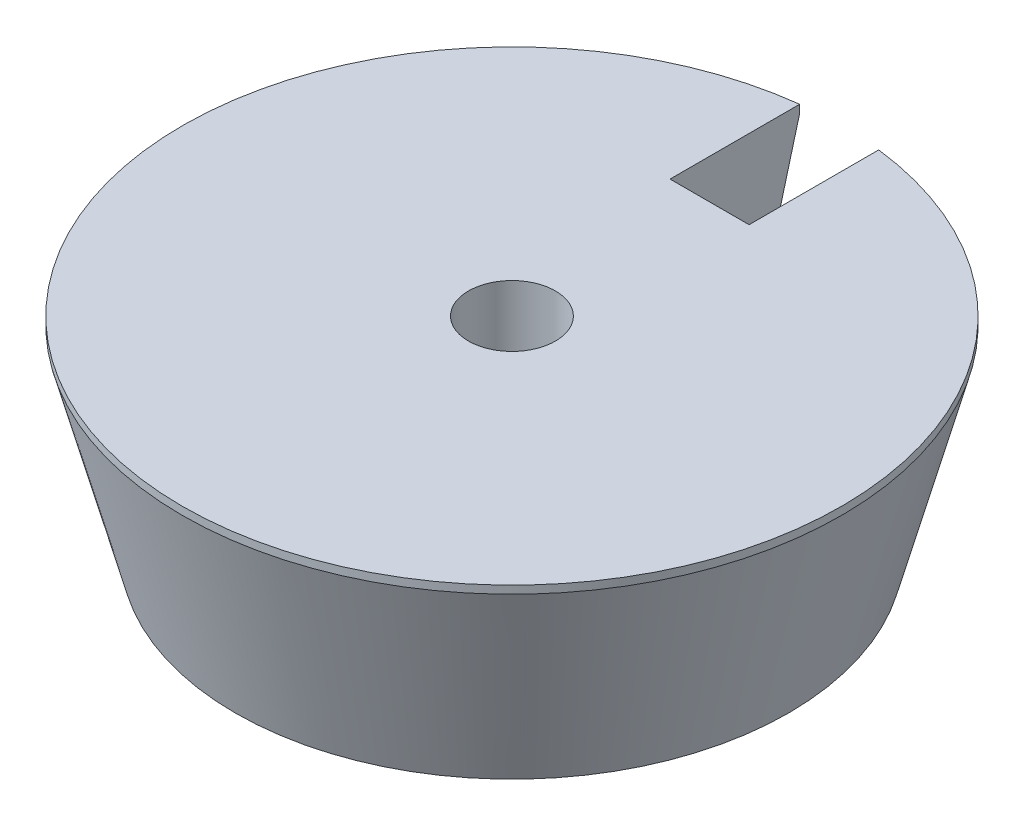
ISO-10303-21;
HEADER;
FILE_DESCRIPTION(('STEP AP214'),'2;1');
FILE_NAME('part.step','',(''),(''),'','','');
FILE_SCHEMA(('AUTOMOTIVE_DESIGN { 1 0 10303 214 1 1 1 1 }'));
ENDSEC;
DATA;
#1=APPLICATION_CONTEXT('core data for automotive mechanical design processes');
#2=APPLICATION_PROTOCOL_DEFINITION('international standard','automotive_design',2000,#1);
#3=PRODUCT_CONTEXT('',#1,'mechanical');
#4=PRODUCT('Part','Part','',(#3));
#5=PRODUCT_RELATED_PRODUCT_CATEGORY('part','',(#4));
#6=PRODUCT_DEFINITION_FORMATION('','',#4);
#7=PRODUCT_DEFINITION_CONTEXT('part definition',#1,'design');
#8=PRODUCT_DEFINITION('design','',#6,#7);
#9=PRODUCT_DEFINITION_SHAPE('','',#8);
#10=(LENGTH_UNIT() NAMED_UNIT(*) SI_UNIT(.MILLI.,.METRE.));
#11=(NAMED_UNIT(*) PLANE_ANGLE_UNIT() SI_UNIT($,.RADIAN.));
#12=(NAMED_UNIT(*) SI_UNIT($,.STERADIAN.) SOLID_ANGLE_UNIT());
#13=UNCERTAINTY_MEASURE_WITH_UNIT(LENGTH_MEASURE(1.E-05),#10,'distance_accuracy_value','');
#14=(GEOMETRIC_REPRESENTATION_CONTEXT(3) GLOBAL_UNCERTAINTY_ASSIGNED_CONTEXT((#13)) GLOBAL_UNIT_ASSIGNED_CONTEXT((#10,
#11,#12)) REPRESENTATION_CONTEXT('',''));
#15=CARTESIAN_POINT('',(0.,0.,0.));
#16=DIRECTION('',(0.,0.,1.));
#17=DIRECTION('',(1.,0.,0.));
#18=AXIS2_PLACEMENT_3D('',#15,#16,#17);
#19=CARTESIAN_POINT('',(0.,0.,0.));
#20=DIRECTION('',(0.,1.,0.));
#21=DIRECTION('',(0.,0.,1.));
#22=AXIS2_PLACEMENT_3D('',#19,#20,#21);
#23=PLANE('',#22);
#24=CARTESIAN_POINT('',(0.,0.,0.));
#25=DIRECTION('',(0.,1.,0.));
#26=DIRECTION('',(0.,0.,1.));
#27=AXIS2_PLACEMENT_3D('',#24,#25,#26);
#28=CIRCLE('',#27,35.);
#29=CARTESIAN_POINT('',(-5.,0.,-34.6410161513776));
#30=VERTEX_POINT('',#29);
#31=CARTESIAN_POINT('',(5.,0.,-34.6410161513776));
#32=VERTEX_POINT('',#31);
#33=EDGE_CURVE('E156',#30,#32,#28,.T.);
#34=ORIENTED_EDGE('',*,*,#33,.F.);
#35=DIRECTION('',(0.,0.,1.));
#36=VECTOR('',#35,1.);
#37=CARTESIAN_POINT('',(-5.,0.,0.));
#38=LINE('',#37,#36);
#39=CARTESIAN_POINT('',(-5.,0.,-25.));
#40=VERTEX_POINT('',#39);
#41=EDGE_CURVE('E52',#30,#40,#38,.T.);
#42=ORIENTED_EDGE('',*,*,#41,.T.);
#43=DIRECTION('',(1.,0.,0.));
#44=VECTOR('',#43,1.);
#45=CARTESIAN_POINT('',(0.,0.,-25.));
#46=LINE('',#45,#44);
#47=CARTESIAN_POINT('',(5.,0.,-25.));
#48=VERTEX_POINT('',#47);
#49=EDGE_CURVE('E120',#40,#48,#46,.T.);
#50=ORIENTED_EDGE('',*,*,#49,.T.);
#51=DIRECTION('',(0.,0.,-1.));
#52=VECTOR('',#51,1.);
#53=CARTESIAN_POINT('',(5.,0.,0.));
#54=LINE('',#53,#52);
#55=EDGE_CURVE('E130',#48,#32,#54,.T.);
#56=ORIENTED_EDGE('',*,*,#55,.T.);
#57=EDGE_LOOP('',(#34,#42,#50,#56));
#58=FACE_BOUND('',#57,.T.);
#59=CARTESIAN_POINT('',(0.,0.,0.));
#60=DIRECTION('',(0.,1.,0.));
#61=DIRECTION('',(0.,0.,1.));
#62=AXIS2_PLACEMENT_3D('',#59,#60,#61);
#63=CIRCLE('',#62,8.);
#64=CARTESIAN_POINT('',(0.,0.,8.));
#65=VERTEX_POINT('',#64);
#66=EDGE_CURVE('E11',#65,#65,#63,.F.);
#67=ORIENTED_EDGE('',*,*,#66,.F.);
#68=EDGE_LOOP('',(#67));
#69=FACE_BOUND('',#68,.T.);
#70=ADVANCED_FACE('F36',(#58,#69),#23,.F.);
#71=CARTESIAN_POINT('',(0.,0.,0.));
#72=DIRECTION('',(0.,1.,0.));
#73=DIRECTION('',(0.,0.,1.));
#74=AXIS2_PLACEMENT_3D('',#71,#72,#73);
#75=CONICAL_SURFACE('',#74,35.,0.261799387799149);
#76=CARTESIAN_POINT('',(0.,25.,0.));
#77=DIRECTION('',(0.,1.,0.));
#78=DIRECTION('',(0.,0.,1.));
#79=AXIS2_PLACEMENT_3D('',#76,#77,#78);
#80=CIRCLE('',#79,41.6987298107781);
#81=CARTESIAN_POINT('',(-5.,25.,-41.3978751608373));
#82=VERTEX_POINT('',#81);
#83=CARTESIAN_POINT('',(5.,25.,-41.3978751608373));
#84=VERTEX_POINT('',#83);
#85=EDGE_CURVE('E45',#82,#84,#80,.T.);
#86=ORIENTED_EDGE('',*,*,#85,.F.);
#87=CARTESIAN_POINT('',(-5.,59.7008365789733,-50.7510855753396));
#88=CARTESIAN_POINT('',(-5.,55.0283029117261,-49.493006797825));
#89=CARTESIAN_POINT('',(-5.,50.3558745568069,-48.2345366221793));
#90=CARTESIAN_POINT('',(-5.,41.0113050061608,-45.7165322731879));
#91=CARTESIAN_POINT('',(-5.,36.3391638104089,-44.4569980999359));
#92=CARTESIAN_POINT('',(-5.,26.9952520128095,-41.9365864160447));
#93=CARTESIAN_POINT('',(-5.,22.3234814103622,-40.6757089076295));
#94=CARTESIAN_POINT('',(-5.,12.980418344324,-38.1521808599432));
#95=CARTESIAN_POINT('',(-5.,8.30912588079699,-36.8895303204348));
#96=CARTESIAN_POINT('',(-5.,-1.03282019481578,-34.36183096867));
#97=CARTESIAN_POINT('',(-5.,-5.70347380561218,-33.0967821516474));
#98=CARTESIAN_POINT('',(-5.,-15.0438748372793,-30.5633478619011));
#99=CARTESIAN_POINT('',(-5.,-19.7136222584475,-29.2949623902745));
#100=CARTESIAN_POINT('',(-5.,-26.7172467487516,-27.3887045992771));
#101=CARTESIAN_POINT('',(-5.,-29.0516243733246,-26.7526714609152));
#102=CARTESIAN_POINT('',(-5.,-33.7199620428748,-25.4790754133097));
#103=CARTESIAN_POINT('',(-5.,-36.0539220879005,-24.8415125042439));
#104=CARTESIAN_POINT('',(-5.,-40.7213245699261,-23.5644839827794));
#105=CARTESIAN_POINT('',(-5.,-43.0547670063553,-22.9250183682945));
#106=CARTESIAN_POINT('',(-5.,-47.7209712490949,-21.6436053928362));
#107=CARTESIAN_POINT('',(-5.,-50.0537330551318,-21.0016580308668));
#108=CARTESIAN_POINT('',(-5.,-52.3860733786992,-20.358180181796));
#109=B_SPLINE_CURVE_WITH_KNOTS('',3,(#87,#88,#89,#90,#91,#92,#93,#94,#95,#96,#97,#98,#99,#100,
#101,#102,#103,#104,#105,#106,#107,#108),.UNSPECIFIED.,.F.,.F.,(4,2,2,2,2,2,2,2,2,2,4),(0.,
14.5168178427988,29.033634408101,43.5504269776351,58.0672214903298,72.5840448823932,
87.1008635017082,94.3592867114056,101.617709077428,108.876139404769,116.134572645342),.UNSPECIFIED.);
#110=EDGE_CURVE('E90',#82,#30,#109,.T.);
#111=ORIENTED_EDGE('',*,*,#110,.T.);
#112=ORIENTED_EDGE('',*,*,#33,.T.);
#113=CARTESIAN_POINT('',(5.,-52.3860733786992,-20.358180181796));
#114=CARTESIAN_POINT('',(5.,-51.0482978654567,-20.7272840873978));
#115=CARTESIAN_POINT('',(5.,-49.7103786134008,-21.095866560875));
#116=CARTESIAN_POINT('',(5.,-47.0342902465631,-21.8321227179531));
#117=CARTESIAN_POINT('',(5.,-45.6961211318131,-22.19979640167));
#118=CARTESIAN_POINT('',(5.,-41.6812962268502,-23.3016551576196));
#119=CARTESIAN_POINT('',(5.,-39.0043215535334,-24.034678299225));
#120=CARTESIAN_POINT('',(5.,-33.6497354982995,-25.4983799823178));
#121=CARTESIAN_POINT('',(5.,-30.9721241172532,-26.2290585269918));
#122=CARTESIAN_POINT('',(5.,-25.6164039314828,-27.6885914327707));
#123=CARTESIAN_POINT('',(5.,-22.9382951266917,-28.4174457936297));
#124=CARTESIAN_POINT('',(5.,-16.2776808286859,-30.2282268937288));
#125=CARTESIAN_POINT('',(5.,-12.2949384062633,-31.3092820370164));
#126=CARTESIAN_POINT('',(5.,-4.32882349930162,-33.4690762140366));
#127=CARTESIAN_POINT('',(5.,-0.345451014422946,-34.5478152465164));
#128=CARTESIAN_POINT('',(5.,8.3091328606096,-36.8895331550201));
#129=CARTESIAN_POINT('',(5.,12.9804327272532,-38.1521850023614));
#130=CARTESIAN_POINT('',(5.,22.3235111703942,-40.6757166880779));
#131=CARTESIAN_POINT('',(5.,26.9952897469089,-41.9365965263888));
#132=CARTESIAN_POINT('',(5.,36.3392023344357,-44.4570085593186));
#133=CARTESIAN_POINT('',(5.,41.0113363448658,-45.7165407560956));
#134=CARTESIAN_POINT('',(5.,50.3558906685911,-48.2345409254183));
#135=CARTESIAN_POINT('',(5.,55.0283109818592,-49.4930088980651));
#136=CARTESIAN_POINT('',(5.,59.7008365789733,-50.7510855753396));
#137=B_SPLINE_CURVE_WITH_KNOTS('',3,(#113,#114,#115,#116,#117,#118,#119,#120,#121,#122,#123,
#124,#125,#126,#127,#128,#129,#130,#131,#132,#133,#134,#135,#136),.UNSPECIFIED.,.F.,.F.,(4,2,2,
2,2,2,2,2,2,2,2,4),(0.,4.16328316354522,8.32656579621177,16.6531269463695,24.9796767746401,
33.3062277258565,45.686786309248,58.0673515876633,72.5841685510812,87.1009860413439,
101.617780249581,116.134573077993),.UNSPECIFIED.);
#138=EDGE_CURVE('E60',#32,#84,#137,.T.);
#139=ORIENTED_EDGE('',*,*,#138,.T.);
#140=EDGE_LOOP('',(#86,#111,#112,#139));
#141=FACE_BOUND('',#140,.T.);
#142=ADVANCED_FACE('F38',(#141),#75,.T.);
#143=CARTESIAN_POINT('',(0.,-12.,0.));
#144=DIRECTION('',(0.,1.,0.));
#145=DIRECTION('',(0.,0.,1.));
#146=AXIS2_PLACEMENT_3D('',#143,#144,#145);
#147=CYLINDRICAL_SURFACE('',#146,8.);
#148=CARTESIAN_POINT('',(0.,-12.,0.));
#149=DIRECTION('',(0.,-1.,0.));
#150=DIRECTION('',(0.,0.,-1.));
#151=AXIS2_PLACEMENT_3D('',#148,#149,#150);
#152=CIRCLE('',#151,8.);
#153=CARTESIAN_POINT('',(0.,-12.,-8.));
#154=VERTEX_POINT('',#153);
#155=EDGE_CURVE('E153',#154,#154,#152,.T.);
#156=ORIENTED_EDGE('',*,*,#155,.F.);
#157=EDGE_LOOP('',(#156));
#158=FACE_BOUND('',#157,.T.);
#159=ORIENTED_EDGE('',*,*,#66,.T.);
#160=EDGE_LOOP('',(#159));
#161=FACE_BOUND('',#160,.T.);
#162=ADVANCED_FACE('F166',(#158,#161),#147,.T.);
#163=CARTESIAN_POINT('',(0.,-12.,0.));
#164=DIRECTION('',(0.,-1.,0.));
#165=DIRECTION('',(0.,0.,-1.));
#166=AXIS2_PLACEMENT_3D('',#163,#164,#165);
#167=PLANE('',#166);
#168=CARTESIAN_POINT('',(0.,-12.,0.));
#169=DIRECTION('',(0.,1.,0.));
#170=DIRECTION('',(0.,0.,1.));
#171=AXIS2_PLACEMENT_3D('',#168,#169,#170);
#172=CIRCLE('',#171,5.49999999999999);
#173=CARTESIAN_POINT('',(0.,-12.,5.49999999999999));
#174=VERTEX_POINT('',#173);
#175=EDGE_CURVE('E108',#174,#174,#172,.T.);
#176=ORIENTED_EDGE('',*,*,#175,.T.);
#177=EDGE_LOOP('',(#176));
#178=FACE_BOUND('',#177,.T.);
#179=ORIENTED_EDGE('',*,*,#155,.T.);
#180=EDGE_LOOP('',(#179));
#181=FACE_BOUND('',#180,.T.);
#182=ADVANCED_FACE('F145',(#178,#181),#167,.T.);
#183=CARTESIAN_POINT('',(-5.,-12.,-55.));
#184=DIRECTION('',(-1.,0.,0.));
#185=DIRECTION('',(0.,0.,1.));
#186=AXIS2_PLACEMENT_3D('',#183,#184,#185);
#187=PLANE('',#186);
#188=ORIENTED_EDGE('',*,*,#110,.F.);
#189=DIRECTION('',(0.,-1.,0.));
#190=VECTOR('',#189,1.);
#191=CARTESIAN_POINT('',(-5.,26.,-41.3978751608373));
#192=LINE('',#191,#190);
#193=CARTESIAN_POINT('',(-5.,26.,-41.3978751608373));
#194=VERTEX_POINT('',#193);
#195=EDGE_CURVE('E84',#194,#82,#192,.T.);
#196=ORIENTED_EDGE('',*,*,#195,.F.);
#197=DIRECTION('',(0.,0.,1.));
#198=VECTOR('',#197,1.);
#199=CARTESIAN_POINT('',(-5.,26.,0.));
#200=LINE('',#199,#198);
#201=CARTESIAN_POINT('',(-5.,26.,-25.));
#202=VERTEX_POINT('',#201);
#203=EDGE_CURVE('E88',#194,#202,#200,.T.);
#204=ORIENTED_EDGE('',*,*,#203,.T.);
#205=DIRECTION('',(0.,1.,0.));
#206=VECTOR('',#205,1.);
#207=CARTESIAN_POINT('',(-5.,-12.,-25.));
#208=LINE('',#207,#206);
#209=EDGE_CURVE('E94',#40,#202,#208,.T.);
#210=ORIENTED_EDGE('',*,*,#209,.F.);
#211=ORIENTED_EDGE('',*,*,#41,.F.);
#212=EDGE_LOOP('',(#188,#196,#204,#210,#211));
#213=FACE_BOUND('',#212,.T.);
#214=ADVANCED_FACE('F86',(#213),#187,.F.);
#215=CARTESIAN_POINT('',(5.,-12.,-55.));
#216=DIRECTION('',(1.,0.,0.));
#217=DIRECTION('',(0.,0.,-1.));
#218=AXIS2_PLACEMENT_3D('',#215,#216,#217);
#219=PLANE('',#218);
#220=DIRECTION('',(0.,1.,0.));
#221=VECTOR('',#220,1.);
#222=CARTESIAN_POINT('',(5.,-12.,-25.));
#223=LINE('',#222,#221);
#224=CARTESIAN_POINT('',(5.,26.,-25.));
#225=VERTEX_POINT('',#224);
#226=EDGE_CURVE('E118',#48,#225,#223,.T.);
#227=ORIENTED_EDGE('',*,*,#226,.T.);
#228=DIRECTION('',(0.,0.,-1.));
#229=VECTOR('',#228,1.);
#230=CARTESIAN_POINT('',(5.,26.,0.));
#231=LINE('',#230,#229);
#232=CARTESIAN_POINT('',(5.,26.,-41.3978751608373));
#233=VERTEX_POINT('',#232);
#234=EDGE_CURVE('E103',#225,#233,#231,.T.);
#235=ORIENTED_EDGE('',*,*,#234,.T.);
#236=DIRECTION('',(0.,-1.,0.));
#237=VECTOR('',#236,1.);
#238=CARTESIAN_POINT('',(5.,26.,-41.3978751608373));
#239=LINE('',#238,#237);
#240=EDGE_CURVE('E95',#233,#84,#239,.T.);
#241=ORIENTED_EDGE('',*,*,#240,.T.);
#242=ORIENTED_EDGE('',*,*,#138,.F.);
#243=ORIENTED_EDGE('',*,*,#55,.F.);
#244=EDGE_LOOP('',(#227,#235,#241,#242,#243));
#245=FACE_BOUND('',#244,.T.);
#246=ADVANCED_FACE('F132',(#245),#219,.F.);
#247=CARTESIAN_POINT('',(-5.,-12.,-25.));
#248=DIRECTION('',(0.,0.,1.));
#249=DIRECTION('',(1.,0.,0.));
#250=AXIS2_PLACEMENT_3D('',#247,#248,#249);
#251=PLANE('',#250);
#252=ORIENTED_EDGE('',*,*,#209,.T.);
#253=DIRECTION('',(1.,0.,0.));
#254=VECTOR('',#253,1.);
#255=CARTESIAN_POINT('',(0.,26.,-25.));
#256=LINE('',#255,#254);
#257=EDGE_CURVE('E107',#202,#225,#256,.T.);
#258=ORIENTED_EDGE('',*,*,#257,.T.);
#259=ORIENTED_EDGE('',*,*,#226,.F.);
#260=ORIENTED_EDGE('',*,*,#49,.F.);
#261=EDGE_LOOP('',(#252,#258,#259,#260));
#262=FACE_BOUND('',#261,.T.);
#263=ADVANCED_FACE('F137',(#262),#251,.F.);
#264=CARTESIAN_POINT('',(0.,26.,0.));
#265=DIRECTION('',(0.,-1.,0.));
#266=DIRECTION('',(0.,0.,-1.));
#267=AXIS2_PLACEMENT_3D('',#264,#265,#266);
#268=CYLINDRICAL_SURFACE('',#267,41.6987298107781);
#269=ORIENTED_EDGE('',*,*,#85,.T.);
#270=ORIENTED_EDGE('',*,*,#240,.F.);
#271=CARTESIAN_POINT('',(0.,26.,0.));
#272=DIRECTION('',(0.,1.,0.));
#273=DIRECTION('',(0.,0.,1.));
#274=AXIS2_PLACEMENT_3D('',#271,#272,#273);
#275=CIRCLE('',#274,41.6987298107781);
#276=EDGE_CURVE('E98',#194,#233,#275,.T.);
#277=ORIENTED_EDGE('',*,*,#276,.F.);
#278=ORIENTED_EDGE('',*,*,#195,.T.);
#279=EDGE_LOOP('',(#269,#270,#277,#278));
#280=FACE_BOUND('',#279,.T.);
#281=ADVANCED_FACE('F99',(#280),#268,.T.);
#282=CARTESIAN_POINT('',(0.,26.,0.));
#283=DIRECTION('',(0.,1.,0.));
#284=DIRECTION('',(0.,0.,1.));
#285=AXIS2_PLACEMENT_3D('',#282,#283,#284);
#286=PLANE('',#285);
#287=CARTESIAN_POINT('',(0.,26.,0.));
#288=DIRECTION('',(0.,1.,0.));
#289=DIRECTION('',(0.,0.,1.));
#290=AXIS2_PLACEMENT_3D('',#287,#288,#289);
#291=CIRCLE('',#290,5.5);
#292=CARTESIAN_POINT('',(0.,26.,5.5));
#293=VERTEX_POINT('',#292);
#294=EDGE_CURVE('E111',#293,#293,#291,.T.);
#295=ORIENTED_EDGE('',*,*,#294,.F.);
#296=EDGE_LOOP('',(#295));
#297=FACE_BOUND('',#296,.T.);
#298=ORIENTED_EDGE('',*,*,#203,.F.);
#299=ORIENTED_EDGE('',*,*,#276,.T.);
#300=ORIENTED_EDGE('',*,*,#234,.F.);
#301=ORIENTED_EDGE('',*,*,#257,.F.);
#302=EDGE_LOOP('',(#298,#299,#300,#301));
#303=FACE_BOUND('',#302,.T.);
#304=ADVANCED_FACE('F105',(#297,#303),#286,.T.);
#305=CARTESIAN_POINT('',(0.,26.,0.));
#306=DIRECTION('',(0.,1.,0.));
#307=DIRECTION('',(0.,0.,1.));
#308=AXIS2_PLACEMENT_3D('',#305,#306,#307);
#309=CYLINDRICAL_SURFACE('',#308,5.49999999999999);
#310=ORIENTED_EDGE('',*,*,#175,.F.);
#311=EDGE_LOOP('',(#310));
#312=FACE_BOUND('',#311,.T.);
#313=ORIENTED_EDGE('',*,*,#294,.T.);
#314=EDGE_LOOP('',(#313));
#315=FACE_BOUND('',#314,.T.);
#316=ADVANCED_FACE('F230',(#312,#315),#309,.F.);
#317=CLOSED_SHELL('',(#70,#142,#162,#182,#214,#246,#263,#281,#304,#316));
#318=MANIFOLD_SOLID_BREP('B2',#317);
#319=ADVANCED_BREP_SHAPE_REPRESENTATION('',(#18,#318),#14);
#320=SHAPE_DEFINITION_REPRESENTATION(#9,#319);
ENDSEC;
END-ISO-10303-21;
